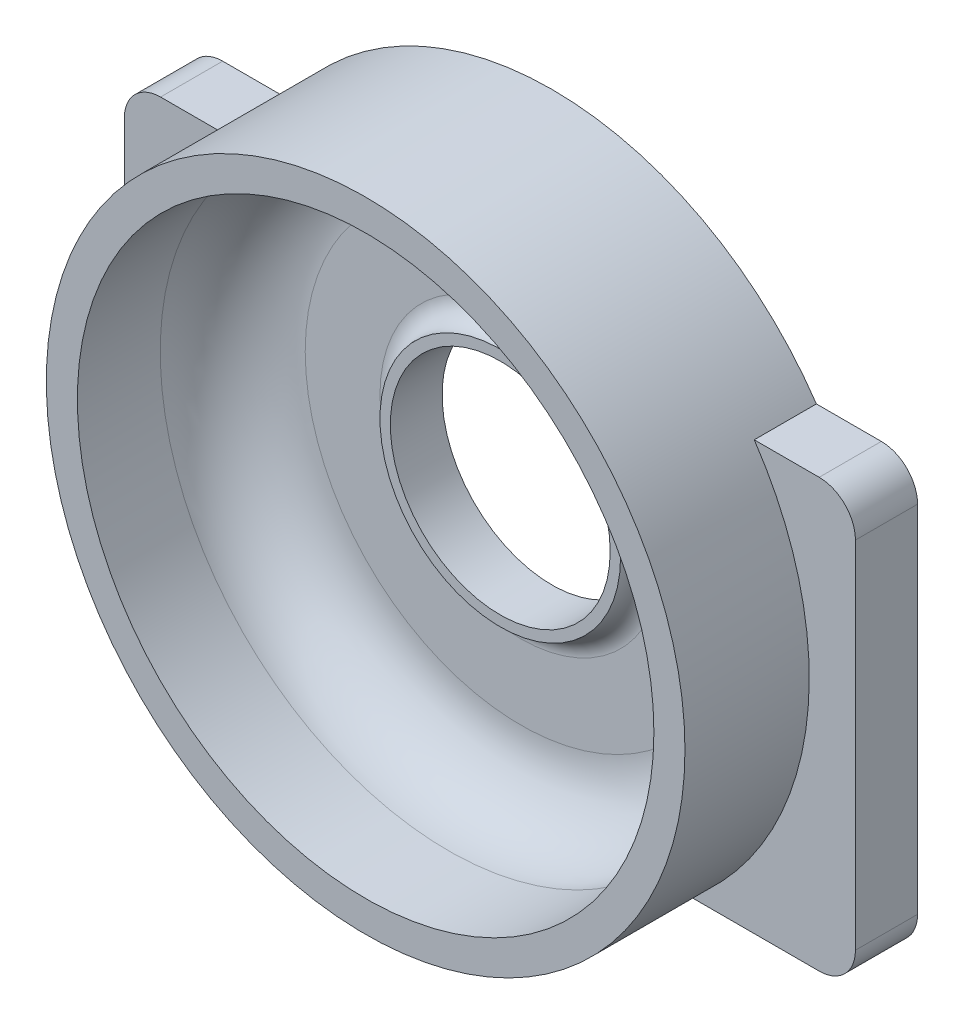
ISO-10303-21;
HEADER;
FILE_DESCRIPTION(('STEP AP214'),'2;1');
FILE_NAME('part.step','',(''),(''),'','','');
FILE_SCHEMA(('AUTOMOTIVE_DESIGN { 1 0 10303 214 1 1 1 1 }'));
ENDSEC;
DATA;
#1=APPLICATION_CONTEXT('core data for automotive mechanical design processes');
#2=APPLICATION_PROTOCOL_DEFINITION('international standard','automotive_design',2000,#1);
#3=PRODUCT_CONTEXT('',#1,'mechanical');
#4=PRODUCT('Part','Part','',(#3));
#5=PRODUCT_RELATED_PRODUCT_CATEGORY('part','',(#4));
#6=PRODUCT_DEFINITION_FORMATION('','',#4);
#7=PRODUCT_DEFINITION_CONTEXT('part definition',#1,'design');
#8=PRODUCT_DEFINITION('design','',#6,#7);
#9=PRODUCT_DEFINITION_SHAPE('','',#8);
#10=(LENGTH_UNIT() NAMED_UNIT(*) SI_UNIT(.MILLI.,.METRE.));
#11=(NAMED_UNIT(*) PLANE_ANGLE_UNIT() SI_UNIT($,.RADIAN.));
#12=(NAMED_UNIT(*) SI_UNIT($,.STERADIAN.) SOLID_ANGLE_UNIT());
#13=UNCERTAINTY_MEASURE_WITH_UNIT(LENGTH_MEASURE(1.E-05),#10,'distance_accuracy_value','');
#14=(GEOMETRIC_REPRESENTATION_CONTEXT(3) GLOBAL_UNCERTAINTY_ASSIGNED_CONTEXT((#13)) GLOBAL_UNIT_ASSIGNED_CONTEXT((#10,
#11,#12)) REPRESENTATION_CONTEXT('',''));
#15=CARTESIAN_POINT('',(0.,0.,0.));
#16=DIRECTION('',(0.,0.,1.));
#17=DIRECTION('',(1.,0.,0.));
#18=AXIS2_PLACEMENT_3D('',#15,#16,#17);
#19=CARTESIAN_POINT('',(-28.2553533638221,23.8718213535977,3.));
#20=DIRECTION('',(0.,0.,-1.));
#21=DIRECTION('',(-1.,0.,0.));
#22=AXIS2_PLACEMENT_3D('',#19,#20,#21);
#23=CYLINDRICAL_SURFACE('',#22,30.8360016176956);
#24=CARTESIAN_POINT('',(-28.2553533638221,23.8718213535977,18.));
#25=DIRECTION('',(0.,0.,1.));
#26=DIRECTION('',(1.,0.,0.));
#27=AXIS2_PLACEMENT_3D('',#24,#25,#26);
#28=CIRCLE('',#27,30.8360016176956);
#29=CARTESIAN_POINT('',(2.58064825387346,23.8718213535977,18.));
#30=VERTEX_POINT('',#29);
#31=EDGE_CURVE('E185',#30,#30,#28,.T.);
#32=ORIENTED_EDGE('',*,*,#31,.F.);
#33=EDGE_LOOP('',(#32));
#34=FACE_BOUND('',#33,.T.);
#35=DIRECTION('',(0.,0.,-1.));
#36=VECTOR('',#35,1.);
#37=CARTESIAN_POINT('',(-53.7830072210789,41.1691588455532,3.));
#38=LINE('',#37,#36);
#39=CARTESIAN_POINT('',(-53.7830072210789,41.1691588455532,6.));
#40=VERTEX_POINT('',#39);
#41=CARTESIAN_POINT('',(-53.7830072210789,41.1691588455532,0.));
#42=VERTEX_POINT('',#41);
#43=EDGE_CURVE('E57',#40,#42,#38,.T.);
#44=ORIENTED_EDGE('',*,*,#43,.F.);
#45=CARTESIAN_POINT('',(-28.2553533638221,23.8718213535977,6.));
#46=DIRECTION('',(0.,0.,-1.));
#47=DIRECTION('',(1.,0.,0.));
#48=AXIS2_PLACEMENT_3D('',#45,#46,#47);
#49=CIRCLE('',#48,30.8360016176956);
#50=CARTESIAN_POINT('',(-47.6133281621177,-0.13084115444675,6.));
#51=VERTEX_POINT('',#50);
#52=EDGE_CURVE('E145',#51,#40,#49,.T.);
#53=ORIENTED_EDGE('',*,*,#52,.F.);
#54=DIRECTION('',(0.,0.,-1.));
#55=VECTOR('',#54,1.);
#56=CARTESIAN_POINT('',(-47.6133281621177,-0.130841154446754,3.));
#57=LINE('',#56,#55);
#58=CARTESIAN_POINT('',(-47.6133281621177,-0.130841154446754,0.));
#59=VERTEX_POINT('',#58);
#60=EDGE_CURVE('E50',#51,#59,#57,.T.);
#61=ORIENTED_EDGE('',*,*,#60,.T.);
#62=CARTESIAN_POINT('',(-28.2553533638221,23.8718213535977,0.));
#63=DIRECTION('',(0.,0.,1.));
#64=DIRECTION('',(1.,0.,0.));
#65=AXIS2_PLACEMENT_3D('',#62,#63,#64);
#66=CIRCLE('',#65,30.8360016176956);
#67=CARTESIAN_POINT('',(-8.89737856552661,-0.130841154446754,0.));
#68=VERTEX_POINT('',#67);
#69=EDGE_CURVE('E190',#59,#68,#66,.T.);
#70=ORIENTED_EDGE('',*,*,#69,.T.);
#71=DIRECTION('',(0.,0.,-1.));
#72=VECTOR('',#71,1.);
#73=CARTESIAN_POINT('',(-8.89737856552661,-0.130841154446754,3.));
#74=LINE('',#73,#72);
#75=CARTESIAN_POINT('',(-8.89737856552661,-0.130841154446757,6.));
#76=VERTEX_POINT('',#75);
#77=EDGE_CURVE('E237',#76,#68,#74,.T.);
#78=ORIENTED_EDGE('',*,*,#77,.F.);
#79=CARTESIAN_POINT('',(-28.2553533638221,23.8718213535977,6.));
#80=DIRECTION('',(0.,0.,-1.));
#81=DIRECTION('',(1.,0.,0.));
#82=AXIS2_PLACEMENT_3D('',#79,#80,#81);
#83=CIRCLE('',#82,30.8360016176956);
#84=CARTESIAN_POINT('',(-2.72769950656544,41.1691588455532,6.));
#85=VERTEX_POINT('',#84);
#86=EDGE_CURVE('E158',#85,#76,#83,.T.);
#87=ORIENTED_EDGE('',*,*,#86,.F.);
#88=DIRECTION('',(0.,0.,-1.));
#89=VECTOR('',#88,1.);
#90=CARTESIAN_POINT('',(-2.72769950656544,41.1691588455532,3.));
#91=LINE('',#90,#89);
#92=CARTESIAN_POINT('',(-2.72769950656544,41.1691588455532,0.));
#93=VERTEX_POINT('',#92);
#94=EDGE_CURVE('E224',#85,#93,#91,.T.);
#95=ORIENTED_EDGE('',*,*,#94,.T.);
#96=CARTESIAN_POINT('',(-28.2553533638221,23.8718213535977,0.));
#97=DIRECTION('',(0.,0.,1.));
#98=DIRECTION('',(1.,0.,0.));
#99=AXIS2_PLACEMENT_3D('',#96,#97,#98);
#100=CIRCLE('',#99,30.8360016176956);
#101=EDGE_CURVE('E204',#93,#42,#100,.T.);
#102=ORIENTED_EDGE('',*,*,#101,.T.);
#103=EDGE_LOOP('',(#44,#53,#61,#70,#78,#87,#95,#102));
#104=FACE_BOUND('',#103,.T.);
#105=ADVANCED_FACE('F35',(#34,#104),#23,.T.);
#106=CARTESIAN_POINT('',(0.,0.,3.));
#107=DIRECTION('',(0.,0.,1.));
#108=DIRECTION('',(1.,0.,0.));
#109=AXIS2_PLACEMENT_3D('',#106,#107,#108);
#110=PLANE('',#109);
#111=CARTESIAN_POINT('',(-28.2553533638221,23.8718213535977,3.));
#112=DIRECTION('',(0.,0.,1.));
#113=DIRECTION('',(1.,0.,0.));
#114=AXIS2_PLACEMENT_3D('',#111,#112,#113);
#115=CIRCLE('',#114,13.6168349442705);
#116=CARTESIAN_POINT('',(-14.6385184195517,23.8718213535977,3.));
#117=VERTEX_POINT('',#116);
#118=EDGE_CURVE('E11',#117,#117,#115,.F.);
#119=ORIENTED_EDGE('',*,*,#118,.T.);
#120=EDGE_LOOP('',(#119));
#121=FACE_BOUND('',#120,.T.);
#122=CARTESIAN_POINT('',(-28.2553533638221,23.8718213535977,3.));
#123=DIRECTION('',(0.,0.,1.));
#124=DIRECTION('',(1.,0.,0.));
#125=AXIS2_PLACEMENT_3D('',#122,#123,#124);
#126=CIRCLE('',#125,20.8360016176956);
#127=CARTESIAN_POINT('',(-7.41935174612654,23.8718213535977,3.));
#128=VERTEX_POINT('',#127);
#129=EDGE_CURVE('E241',#128,#128,#126,.T.);
#130=ORIENTED_EDGE('',*,*,#129,.T.);
#131=EDGE_LOOP('',(#130));
#132=FACE_BOUND('',#131,.T.);
#133=ADVANCED_FACE('F255',(#121,#132),#110,.T.);
#134=CARTESIAN_POINT('',(0.,-0.130841154446754,3.));
#135=DIRECTION('',(0.,1.,0.));
#136=DIRECTION('',(0.,0.,1.));
#137=AXIS2_PLACEMENT_3D('',#134,#135,#136);
#138=PLANE('',#137);
#139=DIRECTION('',(1.,0.,0.));
#140=VECTOR('',#139,1.);
#141=CARTESIAN_POINT('',(0.,-0.130841154446754,0.));
#142=LINE('',#141,#140);
#143=CARTESIAN_POINT('',(-60.058014619295,-0.130841154446754,0.));
#144=VERTEX_POINT('',#143);
#145=EDGE_CURVE('E188',#144,#59,#142,.T.);
#146=ORIENTED_EDGE('',*,*,#145,.T.);
#147=ORIENTED_EDGE('',*,*,#60,.F.);
#148=DIRECTION('',(1.,0.,0.));
#149=VECTOR('',#148,1.);
#150=CARTESIAN_POINT('',(-60.058014619295,-0.130841154446754,6.));
#151=LINE('',#150,#149);
#152=CARTESIAN_POINT('',(-60.058014619295,-0.130841154446756,6.));
#153=VERTEX_POINT('',#152);
#154=EDGE_CURVE('E156',#153,#51,#151,.T.);
#155=ORIENTED_EDGE('',*,*,#154,.F.);
#156=DIRECTION('',(0.,0.,-1.));
#157=VECTOR('',#156,1.);
#158=CARTESIAN_POINT('',(-60.058014619295,-0.130841154446754,3.));
#159=LINE('',#158,#157);
#160=EDGE_CURVE('E217',#153,#144,#159,.T.);
#161=ORIENTED_EDGE('',*,*,#160,.T.);
#162=EDGE_LOOP('',(#146,#147,#155,#161));
#163=FACE_BOUND('',#162,.T.);
#164=ADVANCED_FACE('F257',(#163),#138,.F.);
#165=CARTESIAN_POINT('',(0.,-0.130841154446754,3.));
#166=DIRECTION('',(0.,1.,0.));
#167=DIRECTION('',(0.,0.,1.));
#168=AXIS2_PLACEMENT_3D('',#165,#166,#167);
#169=PLANE('',#168);
#170=DIRECTION('',(1.,0.,0.));
#171=VECTOR('',#170,1.);
#172=CARTESIAN_POINT('',(0.,-0.130841154446754,0.));
#173=LINE('',#172,#171);
#174=CARTESIAN_POINT('',(3.54198538070501,-0.130841154446754,0.));
#175=VERTEX_POINT('',#174);
#176=EDGE_CURVE('E192',#68,#175,#173,.T.);
#177=ORIENTED_EDGE('',*,*,#176,.T.);
#178=DIRECTION('',(0.,0.,-1.));
#179=VECTOR('',#178,1.);
#180=CARTESIAN_POINT('',(3.54198538070501,-0.130841154446754,3.));
#181=LINE('',#180,#179);
#182=CARTESIAN_POINT('',(3.54198538070501,-0.13084115444675,6.));
#183=VERTEX_POINT('',#182);
#184=EDGE_CURVE('E234',#183,#175,#181,.T.);
#185=ORIENTED_EDGE('',*,*,#184,.F.);
#186=DIRECTION('',(1.,0.,0.));
#187=VECTOR('',#186,1.);
#188=CARTESIAN_POINT('',(-8.89737856552661,-0.130841154446757,6.));
#189=LINE('',#188,#187);
#190=EDGE_CURVE('E161',#76,#183,#189,.T.);
#191=ORIENTED_EDGE('',*,*,#190,.F.);
#192=ORIENTED_EDGE('',*,*,#77,.T.);
#193=EDGE_LOOP('',(#177,#185,#191,#192));
#194=FACE_BOUND('',#193,.T.);
#195=ADVANCED_FACE('F264',(#194),#169,.F.);
#196=CARTESIAN_POINT('',(3.54198538070501,3.36915884555326,3.));
#197=DIRECTION('',(0.,0.,-1.));
#198=DIRECTION('',(-1.,0.,0.));
#199=AXIS2_PLACEMENT_3D('',#196,#197,#198);
#200=CYLINDRICAL_SURFACE('',#199,3.5);
#201=CARTESIAN_POINT('',(3.54198538070501,3.36915884555326,0.));
#202=DIRECTION('',(0.,0.,1.));
#203=DIRECTION('',(1.,0.,0.));
#204=AXIS2_PLACEMENT_3D('',#201,#202,#203);
#205=CIRCLE('',#204,3.5);
#206=CARTESIAN_POINT('',(7.04198538070501,3.36915884555326,0.));
#207=VERTEX_POINT('',#206);
#208=EDGE_CURVE('E194',#175,#207,#205,.T.);
#209=ORIENTED_EDGE('',*,*,#208,.T.);
#210=DIRECTION('',(0.,0.,-1.));
#211=VECTOR('',#210,1.);
#212=CARTESIAN_POINT('',(7.04198538070501,3.36915884555326,3.));
#213=LINE('',#212,#211);
#214=CARTESIAN_POINT('',(7.04198538070501,3.36915884555326,6.));
#215=VERTEX_POINT('',#214);
#216=EDGE_CURVE('E231',#215,#207,#213,.T.);
#217=ORIENTED_EDGE('',*,*,#216,.F.);
#218=CARTESIAN_POINT('',(3.54198538070501,3.36915884555326,6.));
#219=DIRECTION('',(0.,0.,1.));
#220=DIRECTION('',(1.,0.,0.));
#221=AXIS2_PLACEMENT_3D('',#218,#219,#220);
#222=CIRCLE('',#221,3.5);
#223=EDGE_CURVE('E164',#183,#215,#222,.T.);
#224=ORIENTED_EDGE('',*,*,#223,.F.);
#225=ORIENTED_EDGE('',*,*,#184,.T.);
#226=EDGE_LOOP('',(#209,#217,#224,#225));
#227=FACE_BOUND('',#226,.T.);
#228=ADVANCED_FACE('F303',(#227),#200,.T.);
#229=CARTESIAN_POINT('',(7.04198538070501,0.,3.));
#230=DIRECTION('',(-1.,0.,0.));
#231=DIRECTION('',(0.,0.,1.));
#232=AXIS2_PLACEMENT_3D('',#229,#230,#231);
#233=PLANE('',#232);
#234=DIRECTION('',(0.,1.,0.));
#235=VECTOR('',#234,1.);
#236=CARTESIAN_POINT('',(7.04198538070501,0.,0.));
#237=LINE('',#236,#235);
#238=CARTESIAN_POINT('',(7.04198538070501,37.6691588455532,0.));
#239=VERTEX_POINT('',#238);
#240=EDGE_CURVE('E196',#207,#239,#237,.T.);
#241=ORIENTED_EDGE('',*,*,#240,.T.);
#242=DIRECTION('',(0.,0.,-1.));
#243=VECTOR('',#242,1.);
#244=CARTESIAN_POINT('',(7.04198538070501,37.6691588455532,3.));
#245=LINE('',#244,#243);
#246=CARTESIAN_POINT('',(7.04198538070501,37.6691588455532,6.));
#247=VERTEX_POINT('',#246);
#248=EDGE_CURVE('E228',#247,#239,#245,.T.);
#249=ORIENTED_EDGE('',*,*,#248,.F.);
#250=DIRECTION('',(0.,1.,0.));
#251=VECTOR('',#250,1.);
#252=CARTESIAN_POINT('',(7.04198538070501,3.36915884555326,6.));
#253=LINE('',#252,#251);
#254=EDGE_CURVE('E167',#215,#247,#253,.T.);
#255=ORIENTED_EDGE('',*,*,#254,.F.);
#256=ORIENTED_EDGE('',*,*,#216,.T.);
#257=EDGE_LOOP('',(#241,#249,#255,#256));
#258=FACE_BOUND('',#257,.T.);
#259=ADVANCED_FACE('F299',(#258),#233,.F.);
#260=CARTESIAN_POINT('',(3.54198538070501,37.6691588455532,3.));
#261=DIRECTION('',(0.,0.,-1.));
#262=DIRECTION('',(-1.,0.,0.));
#263=AXIS2_PLACEMENT_3D('',#260,#261,#262);
#264=CYLINDRICAL_SURFACE('',#263,3.5);
#265=CARTESIAN_POINT('',(3.54198538070501,37.6691588455532,0.));
#266=DIRECTION('',(0.,0.,1.));
#267=DIRECTION('',(1.,0.,0.));
#268=AXIS2_PLACEMENT_3D('',#265,#266,#267);
#269=CIRCLE('',#268,3.5);
#270=CARTESIAN_POINT('',(3.54198538070501,41.1691588455532,0.));
#271=VERTEX_POINT('',#270);
#272=EDGE_CURVE('E198',#239,#271,#269,.T.);
#273=ORIENTED_EDGE('',*,*,#272,.T.);
#274=DIRECTION('',(0.,0.,-1.));
#275=VECTOR('',#274,1.);
#276=CARTESIAN_POINT('',(3.54198538070501,41.1691588455532,3.));
#277=LINE('',#276,#275);
#278=CARTESIAN_POINT('',(3.54198538070501,41.1691588455532,6.));
#279=VERTEX_POINT('',#278);
#280=EDGE_CURVE('E226',#279,#271,#277,.T.);
#281=ORIENTED_EDGE('',*,*,#280,.F.);
#282=CARTESIAN_POINT('',(3.54198538070501,37.6691588455532,6.));
#283=DIRECTION('',(0.,0.,1.));
#284=DIRECTION('',(1.,0.,0.));
#285=AXIS2_PLACEMENT_3D('',#282,#283,#284);
#286=CIRCLE('',#285,3.5);
#287=EDGE_CURVE('E170',#247,#279,#286,.T.);
#288=ORIENTED_EDGE('',*,*,#287,.F.);
#289=ORIENTED_EDGE('',*,*,#248,.T.);
#290=EDGE_LOOP('',(#273,#281,#288,#289));
#291=FACE_BOUND('',#290,.T.);
#292=ADVANCED_FACE('F295',(#291),#264,.T.);
#293=CARTESIAN_POINT('',(0.,41.1691588455532,3.));
#294=DIRECTION('',(0.,1.,0.));
#295=DIRECTION('',(0.,0.,1.));
#296=AXIS2_PLACEMENT_3D('',#293,#294,#295);
#297=PLANE('',#296);
#298=DIRECTION('',(1.,0.,0.));
#299=VECTOR('',#298,1.);
#300=CARTESIAN_POINT('',(0.,41.1691588455532,0.));
#301=LINE('',#300,#299);
#302=EDGE_CURVE('E201',#93,#271,#301,.T.);
#303=ORIENTED_EDGE('',*,*,#302,.F.);
#304=ORIENTED_EDGE('',*,*,#94,.F.);
#305=DIRECTION('',(-1.,0.,0.));
#306=VECTOR('',#305,1.);
#307=CARTESIAN_POINT('',(3.54198538070501,41.1691588455532,6.));
#308=LINE('',#307,#306);
#309=EDGE_CURVE('E173',#279,#85,#308,.T.);
#310=ORIENTED_EDGE('',*,*,#309,.F.);
#311=ORIENTED_EDGE('',*,*,#280,.T.);
#312=EDGE_LOOP('',(#303,#304,#310,#311));
#313=FACE_BOUND('',#312,.T.);
#314=ADVANCED_FACE('F291',(#313),#297,.T.);
#315=CARTESIAN_POINT('',(0.,41.1691588455532,3.));
#316=DIRECTION('',(0.,1.,0.));
#317=DIRECTION('',(0.,0.,1.));
#318=AXIS2_PLACEMENT_3D('',#315,#316,#317);
#319=PLANE('',#318);
#320=DIRECTION('',(1.,0.,0.));
#321=VECTOR('',#320,1.);
#322=CARTESIAN_POINT('',(0.,41.1691588455532,0.));
#323=LINE('',#322,#321);
#324=CARTESIAN_POINT('',(-60.058014619295,41.1691588455532,0.));
#325=VERTEX_POINT('',#324);
#326=EDGE_CURVE('E131',#325,#42,#323,.T.);
#327=ORIENTED_EDGE('',*,*,#326,.F.);
#328=DIRECTION('',(0.,0.,-1.));
#329=VECTOR('',#328,1.);
#330=CARTESIAN_POINT('',(-60.058014619295,41.1691588455532,3.));
#331=LINE('',#330,#329);
#332=CARTESIAN_POINT('',(-60.058014619295,41.1691588455532,6.));
#333=VERTEX_POINT('',#332);
#334=EDGE_CURVE('E125',#333,#325,#331,.T.);
#335=ORIENTED_EDGE('',*,*,#334,.F.);
#336=DIRECTION('',(-1.,0.,0.));
#337=VECTOR('',#336,1.);
#338=CARTESIAN_POINT('',(-53.7830072210789,41.1691588455532,6.));
#339=LINE('',#338,#337);
#340=EDGE_CURVE('E128',#40,#333,#339,.T.);
#341=ORIENTED_EDGE('',*,*,#340,.F.);
#342=ORIENTED_EDGE('',*,*,#43,.T.);
#343=EDGE_LOOP('',(#327,#335,#341,#342));
#344=FACE_BOUND('',#343,.T.);
#345=ADVANCED_FACE('F127',(#344),#319,.T.);
#346=CARTESIAN_POINT('',(-60.058014619295,37.6691588455532,3.));
#347=DIRECTION('',(0.,0.,-1.));
#348=DIRECTION('',(-1.,0.,0.));
#349=AXIS2_PLACEMENT_3D('',#346,#347,#348);
#350=CYLINDRICAL_SURFACE('',#349,3.5);
#351=CARTESIAN_POINT('',(-60.058014619295,37.6691588455532,0.));
#352=DIRECTION('',(0.,0.,1.));
#353=DIRECTION('',(1.,0.,0.));
#354=AXIS2_PLACEMENT_3D('',#351,#352,#353);
#355=CIRCLE('',#354,3.5);
#356=CARTESIAN_POINT('',(-63.558014619295,37.6691588455532,0.));
#357=VERTEX_POINT('',#356);
#358=EDGE_CURVE('E207',#325,#357,#355,.T.);
#359=ORIENTED_EDGE('',*,*,#358,.T.);
#360=DIRECTION('',(0.,0.,-1.));
#361=VECTOR('',#360,1.);
#362=CARTESIAN_POINT('',(-63.558014619295,37.6691588455532,3.));
#363=LINE('',#362,#361);
#364=CARTESIAN_POINT('',(-63.558014619295,37.6691588455532,6.));
#365=VERTEX_POINT('',#364);
#366=EDGE_CURVE('E136',#365,#357,#363,.T.);
#367=ORIENTED_EDGE('',*,*,#366,.F.);
#368=CARTESIAN_POINT('',(-60.058014619295,37.6691588455532,6.));
#369=DIRECTION('',(0.,0.,1.));
#370=DIRECTION('',(1.,0.,0.));
#371=AXIS2_PLACEMENT_3D('',#368,#369,#370);
#372=CIRCLE('',#371,3.49999999999999);
#373=EDGE_CURVE('E142',#333,#365,#372,.T.);
#374=ORIENTED_EDGE('',*,*,#373,.F.);
#375=ORIENTED_EDGE('',*,*,#334,.T.);
#376=EDGE_LOOP('',(#359,#367,#374,#375));
#377=FACE_BOUND('',#376,.T.);
#378=ADVANCED_FACE('F147',(#377),#350,.T.);
#379=CARTESIAN_POINT('',(-63.558014619295,0.,3.));
#380=DIRECTION('',(-1.,0.,0.));
#381=DIRECTION('',(0.,0.,1.));
#382=AXIS2_PLACEMENT_3D('',#379,#380,#381);
#383=PLANE('',#382);
#384=DIRECTION('',(0.,1.,0.));
#385=VECTOR('',#384,1.);
#386=CARTESIAN_POINT('',(-63.558014619295,0.,0.));
#387=LINE('',#386,#385);
#388=CARTESIAN_POINT('',(-63.558014619295,3.36915884555324,0.));
#389=VERTEX_POINT('',#388);
#390=EDGE_CURVE('E209',#389,#357,#387,.T.);
#391=ORIENTED_EDGE('',*,*,#390,.F.);
#392=DIRECTION('',(0.,0.,-1.));
#393=VECTOR('',#392,1.);
#394=CARTESIAN_POINT('',(-63.558014619295,3.36915884555324,3.));
#395=LINE('',#394,#393);
#396=CARTESIAN_POINT('',(-63.558014619295,3.36915884555324,6.));
#397=VERTEX_POINT('',#396);
#398=EDGE_CURVE('E220',#397,#389,#395,.T.);
#399=ORIENTED_EDGE('',*,*,#398,.F.);
#400=DIRECTION('',(0.,-1.,0.));
#401=VECTOR('',#400,1.);
#402=CARTESIAN_POINT('',(-63.558014619295,37.6691588455532,6.));
#403=LINE('',#402,#401);
#404=EDGE_CURVE('E148',#365,#397,#403,.T.);
#405=ORIENTED_EDGE('',*,*,#404,.F.);
#406=ORIENTED_EDGE('',*,*,#366,.T.);
#407=EDGE_LOOP('',(#391,#399,#405,#406));
#408=FACE_BOUND('',#407,.T.);
#409=ADVANCED_FACE('F283',(#408),#383,.T.);
#410=CARTESIAN_POINT('',(-60.058014619295,3.36915884555325,3.));
#411=DIRECTION('',(0.,0.,-1.));
#412=DIRECTION('',(-1.,0.,0.));
#413=AXIS2_PLACEMENT_3D('',#410,#411,#412);
#414=CYLINDRICAL_SURFACE('',#413,3.5);
#415=CARTESIAN_POINT('',(-60.058014619295,3.36915884555325,0.));
#416=DIRECTION('',(0.,0.,1.));
#417=DIRECTION('',(1.,0.,0.));
#418=AXIS2_PLACEMENT_3D('',#415,#416,#417);
#419=CIRCLE('',#418,3.5);
#420=EDGE_CURVE('E212',#389,#144,#419,.T.);
#421=ORIENTED_EDGE('',*,*,#420,.T.);
#422=ORIENTED_EDGE('',*,*,#160,.F.);
#423=CARTESIAN_POINT('',(-60.058014619295,3.36915884555325,6.));
#424=DIRECTION('',(0.,0.,1.));
#425=DIRECTION('',(1.,0.,0.));
#426=AXIS2_PLACEMENT_3D('',#423,#424,#425);
#427=CIRCLE('',#426,3.5);
#428=EDGE_CURVE('E150',#397,#153,#427,.T.);
#429=ORIENTED_EDGE('',*,*,#428,.F.);
#430=ORIENTED_EDGE('',*,*,#398,.T.);
#431=EDGE_LOOP('',(#421,#422,#429,#430));
#432=FACE_BOUND('',#431,.T.);
#433=ADVANCED_FACE('F279',(#432),#414,.T.);
#434=CARTESIAN_POINT('',(-28.2553533638221,23.8718213535977,3.));
#435=DIRECTION('',(0.,0.,-1.));
#436=DIRECTION('',(-1.,0.,0.));
#437=AXIS2_PLACEMENT_3D('',#434,#435,#436);
#438=CYLINDRICAL_SURFACE('',#437,10.6168349442705);
#439=CARTESIAN_POINT('',(-28.2553533638221,23.8718213535977,0.));
#440=DIRECTION('',(0.,0.,1.));
#441=DIRECTION('',(1.,0.,0.));
#442=AXIS2_PLACEMENT_3D('',#439,#440,#441);
#443=CIRCLE('',#442,10.6168349442705);
#444=CARTESIAN_POINT('',(-17.6385184195517,23.8718213535977,0.));
#445=VERTEX_POINT('',#444);
#446=EDGE_CURVE('E214',#445,#445,#443,.T.);
#447=ORIENTED_EDGE('',*,*,#446,.F.);
#448=EDGE_LOOP('',(#447));
#449=FACE_BOUND('',#448,.T.);
#450=CARTESIAN_POINT('',(-28.2553533638221,23.8718213535977,5.));
#451=DIRECTION('',(0.,0.,1.));
#452=DIRECTION('',(1.,0.,0.));
#453=AXIS2_PLACEMENT_3D('',#450,#451,#452);
#454=CIRCLE('',#453,10.6168349442705);
#455=CARTESIAN_POINT('',(-17.6385184195517,23.8718213535977,5.));
#456=VERTEX_POINT('',#455);
#457=EDGE_CURVE('E176',#456,#456,#454,.T.);
#458=ORIENTED_EDGE('',*,*,#457,.T.);
#459=EDGE_LOOP('',(#458));
#460=FACE_BOUND('',#459,.T.);
#461=ADVANCED_FACE('F275',(#449,#460),#438,.F.);
#462=CARTESIAN_POINT('',(0.,0.,0.));
#463=DIRECTION('',(0.,0.,1.));
#464=DIRECTION('',(1.,0.,0.));
#465=AXIS2_PLACEMENT_3D('',#462,#463,#464);
#466=PLANE('',#465);
#467=CARTESIAN_POINT('',(2.04198538070501,4.86915884555324,0.));
#468=DIRECTION('',(0.,0.,-1.));
#469=DIRECTION('',(-1.,0.,0.));
#470=AXIS2_PLACEMENT_3D('',#467,#468,#469);
#471=CIRCLE('',#470,2.38125);
#472=CARTESIAN_POINT('',(-0.339264619294992,4.86915884555324,0.));
#473=VERTEX_POINT('',#472);
#474=EDGE_CURVE('E340',#473,#473,#471,.T.);
#475=ORIENTED_EDGE('',*,*,#474,.F.);
#476=EDGE_LOOP('',(#475));
#477=FACE_BOUND('',#476,.T.);
#478=CARTESIAN_POINT('',(2.04198538070501,33.8691588455533,0.));
#479=DIRECTION('',(0.,0.,-1.));
#480=DIRECTION('',(-1.,0.,0.));
#481=AXIS2_PLACEMENT_3D('',#478,#479,#480);
#482=CIRCLE('',#481,2.38125);
#483=CARTESIAN_POINT('',(-0.339264619294987,33.8691588455533,0.));
#484=VERTEX_POINT('',#483);
#485=EDGE_CURVE('E346',#484,#484,#482,.T.);
#486=ORIENTED_EDGE('',*,*,#485,.F.);
#487=EDGE_LOOP('',(#486));
#488=FACE_BOUND('',#487,.T.);
#489=CARTESIAN_POINT('',(-58.558014619295,33.8691588455533,0.));
#490=DIRECTION('',(0.,0.,-1.));
#491=DIRECTION('',(-1.,0.,0.));
#492=AXIS2_PLACEMENT_3D('',#489,#490,#491);
#493=CIRCLE('',#492,2.38125);
#494=CARTESIAN_POINT('',(-60.939264619295,33.8691588455533,0.));
#495=VERTEX_POINT('',#494);
#496=EDGE_CURVE('E352',#495,#495,#493,.T.);
#497=ORIENTED_EDGE('',*,*,#496,.F.);
#498=EDGE_LOOP('',(#497));
#499=FACE_BOUND('',#498,.T.);
#500=CARTESIAN_POINT('',(-58.558014619295,4.86915884555324,0.));
#501=DIRECTION('',(0.,0.,-1.));
#502=DIRECTION('',(-1.,0.,0.));
#503=AXIS2_PLACEMENT_3D('',#500,#501,#502);
#504=CIRCLE('',#503,2.38125);
#505=CARTESIAN_POINT('',(-60.939264619295,4.86915884555324,0.));
#506=VERTEX_POINT('',#505);
#507=EDGE_CURVE('E334',#506,#506,#504,.T.);
#508=ORIENTED_EDGE('',*,*,#507,.F.);
#509=EDGE_LOOP('',(#508));
#510=FACE_BOUND('',#509,.T.);
#511=ORIENTED_EDGE('',*,*,#145,.F.);
#512=ORIENTED_EDGE('',*,*,#420,.F.);
#513=ORIENTED_EDGE('',*,*,#390,.T.);
#514=ORIENTED_EDGE('',*,*,#358,.F.);
#515=ORIENTED_EDGE('',*,*,#326,.T.);
#516=ORIENTED_EDGE('',*,*,#101,.F.);
#517=ORIENTED_EDGE('',*,*,#302,.T.);
#518=ORIENTED_EDGE('',*,*,#272,.F.);
#519=ORIENTED_EDGE('',*,*,#240,.F.);
#520=ORIENTED_EDGE('',*,*,#208,.F.);
#521=ORIENTED_EDGE('',*,*,#176,.F.);
#522=ORIENTED_EDGE('',*,*,#69,.F.);
#523=EDGE_LOOP('',(#511,#512,#513,#514,#515,#516,#517,#518,#519,#520,#521,#522));
#524=FACE_BOUND('',#523,.T.);
#525=ORIENTED_EDGE('',*,*,#446,.T.);
#526=EDGE_LOOP('',(#525));
#527=FACE_BOUND('',#526,.T.);
#528=ADVANCED_FACE('F272',(#477,#488,#499,#510,#524,#527),#466,.F.);
#529=CARTESIAN_POINT('',(-28.2553533638221,23.8718213535977,18.));
#530=DIRECTION('',(0.,0.,1.));
#531=DIRECTION('',(1.,0.,0.));
#532=AXIS2_PLACEMENT_3D('',#529,#530,#531);
#533=PLANE('',#532);
#534=ORIENTED_EDGE('',*,*,#31,.T.);
#535=EDGE_LOOP('',(#534));
#536=FACE_BOUND('',#535,.T.);
#537=CARTESIAN_POINT('',(-28.2553533638221,23.8718213535977,18.));
#538=DIRECTION('',(0.,0.,1.));
#539=DIRECTION('',(1.,0.,0.));
#540=AXIS2_PLACEMENT_3D('',#537,#538,#539);
#541=CIRCLE('',#540,27.8360016176956);
#542=CARTESIAN_POINT('',(-0.419351746126537,23.8718213535977,18.));
#543=VERTEX_POINT('',#542);
#544=EDGE_CURVE('E182',#543,#543,#541,.T.);
#545=ORIENTED_EDGE('',*,*,#544,.F.);
#546=EDGE_LOOP('',(#545));
#547=FACE_BOUND('',#546,.T.);
#548=ADVANCED_FACE('F270',(#536,#547),#533,.T.);
#549=CARTESIAN_POINT('',(-28.2553533638221,23.8718213535977,18.));
#550=DIRECTION('',(0.,0.,-1.));
#551=DIRECTION('',(-1.,0.,0.));
#552=AXIS2_PLACEMENT_3D('',#549,#550,#551);
#553=CYLINDRICAL_SURFACE('',#552,27.8360016176956);
#554=CARTESIAN_POINT('',(-28.2553533638221,23.8718213535977,10.));
#555=DIRECTION('',(0.,0.,1.));
#556=DIRECTION('',(1.,0.,0.));
#557=AXIS2_PLACEMENT_3D('',#554,#555,#556);
#558=CIRCLE('',#557,27.8360016176956);
#559=CARTESIAN_POINT('',(-0.419351746126537,23.8718213535977,10.));
#560=VERTEX_POINT('',#559);
#561=EDGE_CURVE('E43',#560,#560,#558,.F.);
#562=ORIENTED_EDGE('',*,*,#561,.T.);
#563=EDGE_LOOP('',(#562));
#564=FACE_BOUND('',#563,.T.);
#565=ORIENTED_EDGE('',*,*,#544,.T.);
#566=EDGE_LOOP('',(#565));
#567=FACE_BOUND('',#566,.T.);
#568=ADVANCED_FACE('F246',(#564,#567),#553,.F.);
#569=CARTESIAN_POINT('',(-28.2553533638221,23.8718213535977,10.));
#570=DIRECTION('',(0.,0.,1.));
#571=DIRECTION('',(1.,0.,0.));
#572=AXIS2_PLACEMENT_3D('',#569,#570,#571);
#573=TOROIDAL_SURFACE('',#572,20.8360016176956,7.);
#574=ORIENTED_EDGE('',*,*,#561,.F.);
#575=EDGE_LOOP('',(#574));
#576=FACE_BOUND('',#575,.T.);
#577=ORIENTED_EDGE('',*,*,#129,.F.);
#578=EDGE_LOOP('',(#577));
#579=FACE_BOUND('',#578,.T.);
#580=ADVANCED_FACE('F249',(#576,#579),#573,.F.);
#581=CARTESIAN_POINT('',(-28.2553533638221,23.8718213535977,5.));
#582=DIRECTION('',(0.,0.,1.));
#583=DIRECTION('',(1.,0.,0.));
#584=AXIS2_PLACEMENT_3D('',#581,#582,#583);
#585=PLANE('',#584);
#586=CARTESIAN_POINT('',(-28.2553533638221,23.8718213535977,5.));
#587=DIRECTION('',(0.,0.,1.));
#588=DIRECTION('',(1.,0.,0.));
#589=AXIS2_PLACEMENT_3D('',#586,#587,#588);
#590=CIRCLE('',#589,11.6168349442705);
#591=CARTESIAN_POINT('',(-16.6385184195517,23.8718213535977,5.));
#592=VERTEX_POINT('',#591);
#593=EDGE_CURVE('E179',#592,#592,#590,.T.);
#594=ORIENTED_EDGE('',*,*,#593,.T.);
#595=EDGE_LOOP('',(#594));
#596=FACE_BOUND('',#595,.T.);
#597=ORIENTED_EDGE('',*,*,#457,.F.);
#598=EDGE_LOOP('',(#597));
#599=FACE_BOUND('',#598,.T.);
#600=ADVANCED_FACE('F252',(#596,#599),#585,.T.);
#601=CARTESIAN_POINT('',(-28.2553533638221,23.8718213535977,5.));
#602=DIRECTION('',(0.,0.,1.));
#603=DIRECTION('',(1.,0.,0.));
#604=AXIS2_PLACEMENT_3D('',#601,#602,#603);
#605=TOROIDAL_SURFACE('',#604,13.6168349442705,2.);
#606=ORIENTED_EDGE('',*,*,#118,.F.);
#607=EDGE_LOOP('',(#606));
#608=FACE_BOUND('',#607,.T.);
#609=ORIENTED_EDGE('',*,*,#593,.F.);
#610=EDGE_LOOP('',(#609));
#611=FACE_BOUND('',#610,.T.);
#612=ADVANCED_FACE('F37',(#608,#611),#605,.F.);
#613=CARTESIAN_POINT('',(-28.2553533638221,23.8718213535977,6.));
#614=DIRECTION('',(0.,0.,1.));
#615=DIRECTION('',(1.,0.,0.));
#616=AXIS2_PLACEMENT_3D('',#613,#614,#615);
#617=PLANE('',#616);
#618=ORIENTED_EDGE('',*,*,#86,.T.);
#619=ORIENTED_EDGE('',*,*,#190,.T.);
#620=ORIENTED_EDGE('',*,*,#223,.T.);
#621=ORIENTED_EDGE('',*,*,#254,.T.);
#622=ORIENTED_EDGE('',*,*,#287,.T.);
#623=ORIENTED_EDGE('',*,*,#309,.T.);
#624=EDGE_LOOP('',(#618,#619,#620,#621,#622,#623));
#625=FACE_BOUND('',#624,.T.);
#626=ADVANCED_FACE('F325',(#625),#617,.T.);
#627=CARTESIAN_POINT('',(-28.2553533638221,23.8718213535977,6.));
#628=DIRECTION('',(0.,0.,1.));
#629=DIRECTION('',(1.,0.,0.));
#630=AXIS2_PLACEMENT_3D('',#627,#628,#629);
#631=PLANE('',#630);
#632=ORIENTED_EDGE('',*,*,#52,.T.);
#633=ORIENTED_EDGE('',*,*,#340,.T.);
#634=ORIENTED_EDGE('',*,*,#373,.T.);
#635=ORIENTED_EDGE('',*,*,#404,.T.);
#636=ORIENTED_EDGE('',*,*,#428,.T.);
#637=ORIENTED_EDGE('',*,*,#154,.T.);
#638=EDGE_LOOP('',(#632,#633,#634,#635,#636,#637));
#639=FACE_BOUND('',#638,.T.);
#640=ADVANCED_FACE('F140',(#639),#631,.T.);
#641=CARTESIAN_POINT('',(-58.558014619295,4.86915884555324,3.175));
#642=DIRECTION('',(0.,0.,-1.));
#643=DIRECTION('',(-1.,0.,0.));
#644=AXIS2_PLACEMENT_3D('',#641,#642,#643);
#645=CYLINDRICAL_SURFACE('',#644,2.38125);
#646=CARTESIAN_POINT('',(-58.558014619295,4.86915884555324,3.175));
#647=DIRECTION('',(0.,0.,-1.));
#648=DIRECTION('',(-1.,0.,0.));
#649=AXIS2_PLACEMENT_3D('',#646,#647,#648);
#650=CIRCLE('',#649,2.38125);
#651=CARTESIAN_POINT('',(-60.939264619295,4.86915884555324,3.175));
#652=VERTEX_POINT('',#651);
#653=EDGE_CURVE('E332',#652,#652,#650,.T.);
#654=ORIENTED_EDGE('',*,*,#653,.F.);
#655=EDGE_LOOP('',(#654));
#656=FACE_BOUND('',#655,.T.);
#657=ORIENTED_EDGE('',*,*,#507,.T.);
#658=EDGE_LOOP('',(#657));
#659=FACE_BOUND('',#658,.T.);
#660=ADVANCED_FACE('F370',(#656,#659),#645,.F.);
#661=CARTESIAN_POINT('',(-58.558014619295,4.86915884555324,3.175));
#662=DIRECTION('',(0.,0.,-1.));
#663=DIRECTION('',(-1.,0.,0.));
#664=AXIS2_PLACEMENT_3D('',#661,#662,#663);
#665=PLANE('',#664);
#666=ORIENTED_EDGE('',*,*,#653,.T.);
#667=EDGE_LOOP('',(#666));
#668=FACE_BOUND('',#667,.T.);
#669=ADVANCED_FACE('F363',(#668),#665,.T.);
#670=CARTESIAN_POINT('',(-58.558014619295,33.8691588455533,3.175));
#671=DIRECTION('',(0.,0.,-1.));
#672=DIRECTION('',(-1.,0.,0.));
#673=AXIS2_PLACEMENT_3D('',#670,#671,#672);
#674=CYLINDRICAL_SURFACE('',#673,2.38125);
#675=CARTESIAN_POINT('',(-58.558014619295,33.8691588455533,3.175));
#676=DIRECTION('',(0.,0.,-1.));
#677=DIRECTION('',(-1.,0.,0.));
#678=AXIS2_PLACEMENT_3D('',#675,#676,#677);
#679=CIRCLE('',#678,2.38125);
#680=CARTESIAN_POINT('',(-60.939264619295,33.8691588455533,3.175));
#681=VERTEX_POINT('',#680);
#682=EDGE_CURVE('E338',#681,#681,#679,.T.);
#683=ORIENTED_EDGE('',*,*,#682,.F.);
#684=EDGE_LOOP('',(#683));
#685=FACE_BOUND('',#684,.T.);
#686=ORIENTED_EDGE('',*,*,#496,.T.);
#687=EDGE_LOOP('',(#686));
#688=FACE_BOUND('',#687,.T.);
#689=ADVANCED_FACE('F360',(#685,#688),#674,.F.);
#690=CARTESIAN_POINT('',(-58.558014619295,33.8691588455533,3.175));
#691=DIRECTION('',(0.,0.,-1.));
#692=DIRECTION('',(-1.,0.,0.));
#693=AXIS2_PLACEMENT_3D('',#690,#691,#692);
#694=PLANE('',#693);
#695=ORIENTED_EDGE('',*,*,#682,.T.);
#696=EDGE_LOOP('',(#695));
#697=FACE_BOUND('',#696,.T.);
#698=ADVANCED_FACE('F358',(#697),#694,.T.);
#699=CARTESIAN_POINT('',(2.04198538070501,33.8691588455533,3.175));
#700=DIRECTION('',(0.,0.,-1.));
#701=DIRECTION('',(-1.,0.,0.));
#702=AXIS2_PLACEMENT_3D('',#699,#700,#701);
#703=CYLINDRICAL_SURFACE('',#702,2.38125);
#704=CARTESIAN_POINT('',(2.04198538070501,33.8691588455533,3.175));
#705=DIRECTION('',(0.,0.,-1.));
#706=DIRECTION('',(-1.,0.,0.));
#707=AXIS2_PLACEMENT_3D('',#704,#705,#706);
#708=CIRCLE('',#707,2.38125);
#709=CARTESIAN_POINT('',(-0.339264619294987,33.8691588455533,3.175));
#710=VERTEX_POINT('',#709);
#711=EDGE_CURVE('E349',#710,#710,#708,.T.);
#712=ORIENTED_EDGE('',*,*,#711,.F.);
#713=EDGE_LOOP('',(#712));
#714=FACE_BOUND('',#713,.T.);
#715=ORIENTED_EDGE('',*,*,#485,.T.);
#716=EDGE_LOOP('',(#715));
#717=FACE_BOUND('',#716,.T.);
#718=ADVANCED_FACE('F561',(#714,#717),#703,.F.);
#719=CARTESIAN_POINT('',(2.04198538070501,33.8691588455533,3.175));
#720=DIRECTION('',(0.,0.,-1.));
#721=DIRECTION('',(-1.,0.,0.));
#722=AXIS2_PLACEMENT_3D('',#719,#720,#721);
#723=PLANE('',#722);
#724=ORIENTED_EDGE('',*,*,#711,.T.);
#725=EDGE_LOOP('',(#724));
#726=FACE_BOUND('',#725,.T.);
#727=ADVANCED_FACE('F569',(#726),#723,.T.);
#728=CARTESIAN_POINT('',(2.04198538070501,4.86915884555324,3.175));
#729=DIRECTION('',(0.,0.,-1.));
#730=DIRECTION('',(-1.,0.,0.));
#731=AXIS2_PLACEMENT_3D('',#728,#729,#730);
#732=CYLINDRICAL_SURFACE('',#731,2.38125);
#733=CARTESIAN_POINT('',(2.04198538070501,4.86915884555324,3.175));
#734=DIRECTION('',(0.,0.,-1.));
#735=DIRECTION('',(-1.,0.,0.));
#736=AXIS2_PLACEMENT_3D('',#733,#734,#735);
#737=CIRCLE('',#736,2.38125);
#738=CARTESIAN_POINT('',(-0.339264619294992,4.86915884555324,3.175));
#739=VERTEX_POINT('',#738);
#740=EDGE_CURVE('E343',#739,#739,#737,.T.);
#741=ORIENTED_EDGE('',*,*,#740,.F.);
#742=EDGE_LOOP('',(#741));
#743=FACE_BOUND('',#742,.T.);
#744=ORIENTED_EDGE('',*,*,#474,.T.);
#745=EDGE_LOOP('',(#744));
#746=FACE_BOUND('',#745,.T.);
#747=ADVANCED_FACE('F578',(#743,#746),#732,.F.);
#748=CARTESIAN_POINT('',(2.04198538070501,4.86915884555324,3.175));
#749=DIRECTION('',(0.,0.,-1.));
#750=DIRECTION('',(-1.,0.,0.));
#751=AXIS2_PLACEMENT_3D('',#748,#749,#750);
#752=PLANE('',#751);
#753=ORIENTED_EDGE('',*,*,#740,.T.);
#754=EDGE_LOOP('',(#753));
#755=FACE_BOUND('',#754,.T.);
#756=ADVANCED_FACE('F587',(#755),#752,.T.);
#757=CLOSED_SHELL('',(#105,#133,#164,#195,#228,#259,#292,#314,#345,#378,#409,#433,#461,#528,
#548,#568,#580,#600,#612,#626,#640,#660,#669,#689,#698,#718,#727,#747,#756));
#758=MANIFOLD_SOLID_BREP('B2',#757);
#759=ADVANCED_BREP_SHAPE_REPRESENTATION('',(#18,#758),#14);
#760=SHAPE_DEFINITION_REPRESENTATION(#9,#759);
ENDSEC;
END-ISO-10303-21;
